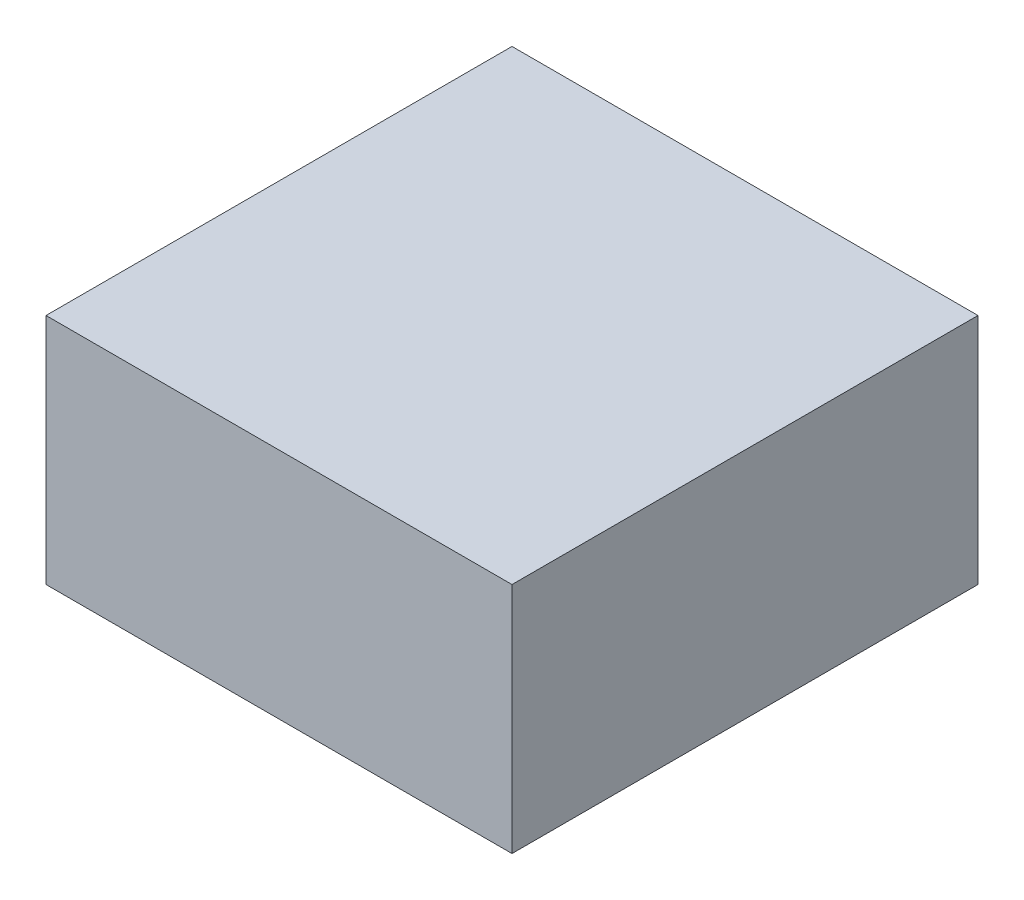
ISO-10303-21;
HEADER;
FILE_DESCRIPTION(('STEP AP214'),'2;1');
FILE_NAME('part.step','',(''),(''),'','','');
FILE_SCHEMA(('AUTOMOTIVE_DESIGN { 1 0 10303 214 1 1 1 1 }'));
ENDSEC;
DATA;
#1=APPLICATION_CONTEXT('core data for automotive mechanical design processes');
#2=APPLICATION_PROTOCOL_DEFINITION('international standard','automotive_design',2000,#1);
#3=PRODUCT_CONTEXT('',#1,'mechanical');
#4=PRODUCT('Part','Part','',(#3));
#5=PRODUCT_RELATED_PRODUCT_CATEGORY('part','',(#4));
#6=PRODUCT_DEFINITION_FORMATION('','',#4);
#7=PRODUCT_DEFINITION_CONTEXT('part definition',#1,'design');
#8=PRODUCT_DEFINITION('design','',#6,#7);
#9=PRODUCT_DEFINITION_SHAPE('','',#8);
#10=(LENGTH_UNIT() NAMED_UNIT(*) SI_UNIT(.MILLI.,.METRE.));
#11=(NAMED_UNIT(*) PLANE_ANGLE_UNIT() SI_UNIT($,.RADIAN.));
#12=(NAMED_UNIT(*) SI_UNIT($,.STERADIAN.) SOLID_ANGLE_UNIT());
#13=UNCERTAINTY_MEASURE_WITH_UNIT(LENGTH_MEASURE(1.E-05),#10,'distance_accuracy_value','');
#14=(GEOMETRIC_REPRESENTATION_CONTEXT(3) GLOBAL_UNCERTAINTY_ASSIGNED_CONTEXT((#13)) GLOBAL_UNIT_ASSIGNED_CONTEXT((#10,
#11,#12)) REPRESENTATION_CONTEXT('',''));
#15=CARTESIAN_POINT('',(0.,0.,0.));
#16=DIRECTION('',(0.,0.,1.));
#17=DIRECTION('',(1.,0.,0.));
#18=AXIS2_PLACEMENT_3D('',#15,#16,#17);
#19=CARTESIAN_POINT('',(-34.2342342342342,30.,-35.6756756756757));
#20=DIRECTION('',(1.,0.,0.));
#21=DIRECTION('',(0.,0.,-1.));
#22=AXIS2_PLACEMENT_3D('',#19,#20,#21);
#23=PLANE('',#22);
#24=DIRECTION('',(0.,0.,1.));
#25=VECTOR('',#24,1.);
#26=CARTESIAN_POINT('',(-34.2342342342342,0.,-35.6756756756757));
#27=LINE('',#26,#25);
#28=CARTESIAN_POINT('',(-34.2342342342342,0.,-35.6756756756757));
#29=VERTEX_POINT('',#28);
#30=CARTESIAN_POINT('',(-34.2342342342342,0.,24.3243243243243));
#31=VERTEX_POINT('',#30);
#32=EDGE_CURVE('E96',#29,#31,#27,.T.);
#33=ORIENTED_EDGE('',*,*,#32,.T.);
#34=DIRECTION('',(0.,-1.,0.));
#35=VECTOR('',#34,1.);
#36=CARTESIAN_POINT('',(-34.2342342342342,30.,24.3243243243243));
#37=LINE('',#36,#35);
#38=CARTESIAN_POINT('',(-34.2342342342342,30.,24.3243243243243));
#39=VERTEX_POINT('',#38);
#40=EDGE_CURVE('E11',#39,#31,#37,.T.);
#41=ORIENTED_EDGE('',*,*,#40,.F.);
#42=DIRECTION('',(0.,0.,1.));
#43=VECTOR('',#42,1.);
#44=CARTESIAN_POINT('',(-34.2342342342342,30.,-35.6756756756757));
#45=LINE('',#44,#43);
#46=CARTESIAN_POINT('',(-34.2342342342342,30.,-35.6756756756757));
#47=VERTEX_POINT('',#46);
#48=EDGE_CURVE('E84',#47,#39,#45,.T.);
#49=ORIENTED_EDGE('',*,*,#48,.F.);
#50=DIRECTION('',(0.,-1.,0.));
#51=VECTOR('',#50,1.);
#52=CARTESIAN_POINT('',(-34.2342342342342,30.,-35.6756756756757));
#53=LINE('',#52,#51);
#54=EDGE_CURVE('E92',#47,#29,#53,.T.);
#55=ORIENTED_EDGE('',*,*,#54,.T.);
#56=EDGE_LOOP('',(#33,#41,#49,#55));
#57=FACE_BOUND('',#56,.T.);
#58=ADVANCED_FACE('F33',(#57),#23,.F.);
#59=CARTESIAN_POINT('',(-34.2342342342342,30.,24.3243243243243));
#60=DIRECTION('',(0.,0.,-1.));
#61=DIRECTION('',(-1.,0.,0.));
#62=AXIS2_PLACEMENT_3D('',#59,#60,#61);
#63=PLANE('',#62);
#64=DIRECTION('',(1.,0.,0.));
#65=VECTOR('',#64,1.);
#66=CARTESIAN_POINT('',(-34.2342342342342,0.,24.3243243243243));
#67=LINE('',#66,#65);
#68=CARTESIAN_POINT('',(25.7657657657658,0.,24.3243243243243));
#69=VERTEX_POINT('',#68);
#70=EDGE_CURVE('E88',#31,#69,#67,.T.);
#71=ORIENTED_EDGE('',*,*,#70,.T.);
#72=DIRECTION('',(0.,-1.,0.));
#73=VECTOR('',#72,1.);
#74=CARTESIAN_POINT('',(25.7657657657658,30.,24.3243243243243));
#75=LINE('',#74,#73);
#76=CARTESIAN_POINT('',(25.7657657657658,30.,24.3243243243243));
#77=VERTEX_POINT('',#76);
#78=EDGE_CURVE('E41',#77,#69,#75,.T.);
#79=ORIENTED_EDGE('',*,*,#78,.F.);
#80=DIRECTION('',(1.,0.,0.));
#81=VECTOR('',#80,1.);
#82=CARTESIAN_POINT('',(-34.2342342342342,30.,24.3243243243243));
#83=LINE('',#82,#81);
#84=EDGE_CURVE('E79',#39,#77,#83,.T.);
#85=ORIENTED_EDGE('',*,*,#84,.F.);
#86=ORIENTED_EDGE('',*,*,#40,.T.);
#87=EDGE_LOOP('',(#71,#79,#85,#86));
#88=FACE_BOUND('',#87,.T.);
#89=ADVANCED_FACE('F87',(#88),#63,.F.);
#90=CARTESIAN_POINT('',(25.7657657657658,30.,-35.6756756756757));
#91=DIRECTION('',(-1.,0.,0.));
#92=DIRECTION('',(0.,0.,1.));
#93=AXIS2_PLACEMENT_3D('',#90,#91,#92);
#94=PLANE('',#93);
#95=DIRECTION('',(0.,0.,-1.));
#96=VECTOR('',#95,1.);
#97=CARTESIAN_POINT('',(25.7657657657658,0.,-35.6756756756757));
#98=LINE('',#97,#96);
#99=CARTESIAN_POINT('',(25.7657657657658,0.,-35.6756756756757));
#100=VERTEX_POINT('',#99);
#101=EDGE_CURVE('E66',#69,#100,#98,.T.);
#102=ORIENTED_EDGE('',*,*,#101,.T.);
#103=DIRECTION('',(0.,-1.,0.));
#104=VECTOR('',#103,1.);
#105=CARTESIAN_POINT('',(25.7657657657658,30.,-35.6756756756757));
#106=LINE('',#105,#104);
#107=CARTESIAN_POINT('',(25.7657657657658,30.,-35.6756756756757));
#108=VERTEX_POINT('',#107);
#109=EDGE_CURVE('E89',#108,#100,#106,.T.);
#110=ORIENTED_EDGE('',*,*,#109,.F.);
#111=DIRECTION('',(0.,0.,-1.));
#112=VECTOR('',#111,1.);
#113=CARTESIAN_POINT('',(25.7657657657658,30.,-35.6756756756757));
#114=LINE('',#113,#112);
#115=EDGE_CURVE('E82',#77,#108,#114,.T.);
#116=ORIENTED_EDGE('',*,*,#115,.F.);
#117=ORIENTED_EDGE('',*,*,#78,.T.);
#118=EDGE_LOOP('',(#102,#110,#116,#117));
#119=FACE_BOUND('',#118,.T.);
#120=ADVANCED_FACE('F90',(#119),#94,.F.);
#121=CARTESIAN_POINT('',(-34.2342342342342,30.,-35.6756756756757));
#122=DIRECTION('',(0.,0.,1.));
#123=DIRECTION('',(1.,0.,0.));
#124=AXIS2_PLACEMENT_3D('',#121,#122,#123);
#125=PLANE('',#124);
#126=DIRECTION('',(-1.,0.,0.));
#127=VECTOR('',#126,1.);
#128=CARTESIAN_POINT('',(-34.2342342342342,0.,-35.6756756756757));
#129=LINE('',#128,#127);
#130=EDGE_CURVE('E72',#100,#29,#129,.T.);
#131=ORIENTED_EDGE('',*,*,#130,.T.);
#132=ORIENTED_EDGE('',*,*,#54,.F.);
#133=DIRECTION('',(-1.,0.,0.));
#134=VECTOR('',#133,1.);
#135=CARTESIAN_POINT('',(-34.2342342342342,30.,-35.6756756756757));
#136=LINE('',#135,#134);
#137=EDGE_CURVE('E49',#108,#47,#136,.T.);
#138=ORIENTED_EDGE('',*,*,#137,.F.);
#139=ORIENTED_EDGE('',*,*,#109,.T.);
#140=EDGE_LOOP('',(#131,#132,#138,#139));
#141=FACE_BOUND('',#140,.T.);
#142=ADVANCED_FACE('F103',(#141),#125,.F.);
#143=CARTESIAN_POINT('',(0.,30.,0.));
#144=DIRECTION('',(0.,1.,0.));
#145=DIRECTION('',(0.,0.,1.));
#146=AXIS2_PLACEMENT_3D('',#143,#144,#145);
#147=PLANE('',#146);
#148=ORIENTED_EDGE('',*,*,#48,.T.);
#149=ORIENTED_EDGE('',*,*,#84,.T.);
#150=ORIENTED_EDGE('',*,*,#115,.T.);
#151=ORIENTED_EDGE('',*,*,#137,.T.);
#152=EDGE_LOOP('',(#148,#149,#150,#151));
#153=FACE_BOUND('',#152,.T.);
#154=ADVANCED_FACE('F80',(#153),#147,.T.);
#155=CARTESIAN_POINT('',(0.,0.,0.));
#156=DIRECTION('',(0.,1.,0.));
#157=DIRECTION('',(0.,0.,1.));
#158=AXIS2_PLACEMENT_3D('',#155,#156,#157);
#159=PLANE('',#158);
#160=ORIENTED_EDGE('',*,*,#32,.F.);
#161=ORIENTED_EDGE('',*,*,#130,.F.);
#162=ORIENTED_EDGE('',*,*,#101,.F.);
#163=ORIENTED_EDGE('',*,*,#70,.F.);
#164=EDGE_LOOP('',(#160,#161,#162,#163));
#165=FACE_BOUND('',#164,.T.);
#166=ADVANCED_FACE('F106',(#165),#159,.F.);
#167=CLOSED_SHELL('',(#58,#89,#120,#142,#154,#166));
#168=MANIFOLD_SOLID_BREP('B2',#167);
#169=ADVANCED_BREP_SHAPE_REPRESENTATION('',(#18,#168),#14);
#170=SHAPE_DEFINITION_REPRESENTATION(#9,#169);
ENDSEC;
END-ISO-10303-21;
